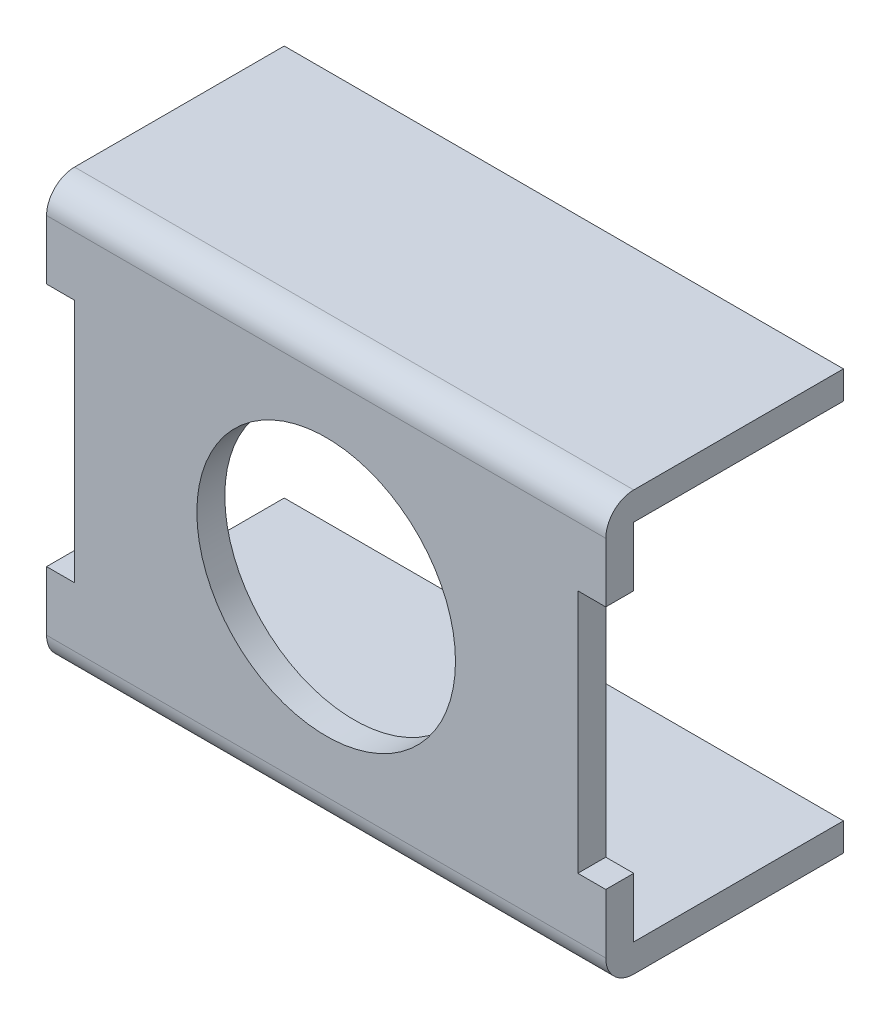
ISO-10303-21;
HEADER;
FILE_DESCRIPTION(('STEP AP214'),'2;1');
FILE_NAME('part.step','',(''),(''),'','','');
FILE_SCHEMA(('AUTOMOTIVE_DESIGN { 1 0 10303 214 1 1 1 1 }'));
ENDSEC;
DATA;
#1=APPLICATION_CONTEXT('core data for automotive mechanical design processes');
#2=APPLICATION_PROTOCOL_DEFINITION('international standard','automotive_design',2000,#1);
#3=PRODUCT_CONTEXT('',#1,'mechanical');
#4=PRODUCT('Part','Part','',(#3));
#5=PRODUCT_RELATED_PRODUCT_CATEGORY('part','',(#4));
#6=PRODUCT_DEFINITION_FORMATION('','',#4);
#7=PRODUCT_DEFINITION_CONTEXT('part definition',#1,'design');
#8=PRODUCT_DEFINITION('design','',#6,#7);
#9=PRODUCT_DEFINITION_SHAPE('','',#8);
#10=(LENGTH_UNIT() NAMED_UNIT(*) SI_UNIT(.MILLI.,.METRE.));
#11=(NAMED_UNIT(*) PLANE_ANGLE_UNIT() SI_UNIT($,.RADIAN.));
#12=(NAMED_UNIT(*) SI_UNIT($,.STERADIAN.) SOLID_ANGLE_UNIT());
#13=UNCERTAINTY_MEASURE_WITH_UNIT(LENGTH_MEASURE(1.E-05),#10,'distance_accuracy_value','');
#14=(GEOMETRIC_REPRESENTATION_CONTEXT(3) GLOBAL_UNCERTAINTY_ASSIGNED_CONTEXT((#13)) GLOBAL_UNIT_ASSIGNED_CONTEXT((#10,
#11,#12)) REPRESENTATION_CONTEXT('',''));
#15=CARTESIAN_POINT('',(0.,0.,0.));
#16=DIRECTION('',(0.,0.,1.));
#17=DIRECTION('',(1.,0.,0.));
#18=AXIS2_PLACEMENT_3D('',#15,#16,#17);
#19=CARTESIAN_POINT('',(2.,1.324596774194,-0.512903225806));
#20=DIRECTION('',(1.,0.,0.));
#21=DIRECTION('',(0.,0.,-1.));
#22=AXIS2_PLACEMENT_3D('',#19,#20,#21);
#23=PLANE('',#22);
#24=DIRECTION('',(0.,0.,1.));
#25=VECTOR('',#24,1.);
#26=CARTESIAN_POINT('',(2.,1.3,0.));
#27=LINE('',#26,#25);
#28=CARTESIAN_POINT('',(2.,1.3,0.));
#29=VERTEX_POINT('',#28);
#30=CARTESIAN_POINT('',(2.,1.3,-1.5));
#31=VERTEX_POINT('',#30);
#32=EDGE_CURVE('E221',#29,#31,#27,.F.);
#33=ORIENTED_EDGE('',*,*,#32,.T.);
#34=DIRECTION('',(0.,1.,0.));
#35=VECTOR('',#34,1.);
#36=CARTESIAN_POINT('',(2.,0.,-1.5));
#37=LINE('',#36,#35);
#38=CARTESIAN_POINT('',(2.,1.5,-1.5));
#39=VERTEX_POINT('',#38);
#40=EDGE_CURVE('E153',#31,#39,#37,.T.);
#41=ORIENTED_EDGE('',*,*,#40,.T.);
#42=DIRECTION('',(0.,0.,1.));
#43=VECTOR('',#42,1.);
#44=CARTESIAN_POINT('',(2.,1.5,-0.65));
#45=LINE('',#44,#43);
#46=CARTESIAN_POINT('',(2.,1.5,0.));
#47=VERTEX_POINT('',#46);
#48=EDGE_CURVE('E151',#47,#39,#45,.F.);
#49=ORIENTED_EDGE('',*,*,#48,.F.);
#50=CARTESIAN_POINT('',(2.,1.3,0.));
#51=DIRECTION('',(-1.,0.,0.));
#52=DIRECTION('',(0.,0.,1.));
#53=AXIS2_PLACEMENT_3D('',#50,#51,#52);
#54=CIRCLE('',#53,0.2);
#55=CARTESIAN_POINT('',(2.,1.3,0.2));
#56=VERTEX_POINT('',#55);
#57=EDGE_CURVE('E20',#47,#56,#54,.F.);
#58=ORIENTED_EDGE('',*,*,#57,.T.);
#59=DIRECTION('',(0.,1.,0.));
#60=VECTOR('',#59,1.);
#61=CARTESIAN_POINT('',(2.,1.324596774194,0.2));
#62=LINE('',#61,#60);
#63=CARTESIAN_POINT('',(2.,0.875,0.2));
#64=VERTEX_POINT('',#63);
#65=EDGE_CURVE('E149',#56,#64,#62,.F.);
#66=ORIENTED_EDGE('',*,*,#65,.T.);
#67=DIRECTION('',(0.,0.,-1.));
#68=VECTOR('',#67,1.);
#69=CARTESIAN_POINT('',(2.,0.875,-0.512903225806));
#70=LINE('',#69,#68);
#71=CARTESIAN_POINT('',(2.,0.875,0.));
#72=VERTEX_POINT('',#71);
#73=EDGE_CURVE('E195',#64,#72,#70,.T.);
#74=ORIENTED_EDGE('',*,*,#73,.T.);
#75=DIRECTION('',(0.,1.,0.));
#76=VECTOR('',#75,1.);
#77=CARTESIAN_POINT('',(2.,1.324596774194,0.));
#78=LINE('',#77,#76);
#79=EDGE_CURVE('E189',#72,#29,#78,.T.);
#80=ORIENTED_EDGE('',*,*,#79,.T.);
#81=EDGE_LOOP('',(#33,#41,#49,#58,#66,#74,#80));
#82=FACE_BOUND('',#81,.T.);
#83=ADVANCED_FACE('F17',(#82),#23,.T.);
#84=CARTESIAN_POINT('',(0.,0.,-1.5));
#85=DIRECTION('',(0.,0.,1.));
#86=DIRECTION('',(1.,0.,0.));
#87=AXIS2_PLACEMENT_3D('',#84,#85,#86);
#88=PLANE('',#87);
#89=ORIENTED_EDGE('',*,*,#40,.F.);
#90=DIRECTION('',(1.,0.,0.));
#91=VECTOR('',#90,1.);
#92=CARTESIAN_POINT('',(2.,1.3,-1.5));
#93=LINE('',#92,#91);
#94=CARTESIAN_POINT('',(-2.,1.3,-1.5));
#95=VERTEX_POINT('',#94);
#96=EDGE_CURVE('E241',#31,#95,#93,.F.);
#97=ORIENTED_EDGE('',*,*,#96,.T.);
#98=DIRECTION('',(0.,1.,0.));
#99=VECTOR('',#98,1.);
#100=CARTESIAN_POINT('',(-2.,1.324596774194,-1.5));
#101=LINE('',#100,#99);
#102=CARTESIAN_POINT('',(-2.,1.5,-1.5));
#103=VERTEX_POINT('',#102);
#104=EDGE_CURVE('E177',#103,#95,#101,.F.);
#105=ORIENTED_EDGE('',*,*,#104,.F.);
#106=DIRECTION('',(1.,0.,0.));
#107=VECTOR('',#106,1.);
#108=CARTESIAN_POINT('',(0.,1.5,-1.5));
#109=LINE('',#108,#107);
#110=EDGE_CURVE('E157',#39,#103,#109,.F.);
#111=ORIENTED_EDGE('',*,*,#110,.F.);
#112=EDGE_LOOP('',(#89,#97,#105,#111));
#113=FACE_BOUND('',#112,.T.);
#114=ADVANCED_FACE('F401',(#113),#88,.F.);
#115=CARTESIAN_POINT('',(-2.,1.324596774194,-0.512903225806));
#116=DIRECTION('',(-1.,0.,0.));
#117=DIRECTION('',(0.,0.,1.));
#118=AXIS2_PLACEMENT_3D('',#115,#116,#117);
#119=PLANE('',#118);
#120=DIRECTION('',(0.,1.,0.));
#121=VECTOR('',#120,1.);
#122=CARTESIAN_POINT('',(-2.,1.324596774194,0.));
#123=LINE('',#122,#121);
#124=CARTESIAN_POINT('',(-2.,1.3,0.));
#125=VERTEX_POINT('',#124);
#126=CARTESIAN_POINT('',(-2.,0.875,0.));
#127=VERTEX_POINT('',#126);
#128=EDGE_CURVE('E180',#125,#127,#123,.F.);
#129=ORIENTED_EDGE('',*,*,#128,.T.);
#130=DIRECTION('',(0.,0.,1.));
#131=VECTOR('',#130,1.);
#132=CARTESIAN_POINT('',(-2.,0.875,-0.512903225806));
#133=LINE('',#132,#131);
#134=CARTESIAN_POINT('',(-2.,0.875,0.2));
#135=VERTEX_POINT('',#134);
#136=EDGE_CURVE('E256',#127,#135,#133,.T.);
#137=ORIENTED_EDGE('',*,*,#136,.T.);
#138=DIRECTION('',(0.,1.,0.));
#139=VECTOR('',#138,1.);
#140=CARTESIAN_POINT('',(-2.,1.324596774194,0.2));
#141=LINE('',#140,#139);
#142=CARTESIAN_POINT('',(-2.,1.3,0.2));
#143=VERTEX_POINT('',#142);
#144=EDGE_CURVE('E188',#135,#143,#141,.T.);
#145=ORIENTED_EDGE('',*,*,#144,.T.);
#146=CARTESIAN_POINT('',(-2.,1.3,0.));
#147=DIRECTION('',(-1.,0.,0.));
#148=DIRECTION('',(0.,0.,1.));
#149=AXIS2_PLACEMENT_3D('',#146,#147,#148);
#150=CIRCLE('',#149,0.2);
#151=CARTESIAN_POINT('',(-2.,1.5,0.));
#152=VERTEX_POINT('',#151);
#153=EDGE_CURVE('E181',#143,#152,#150,.T.);
#154=ORIENTED_EDGE('',*,*,#153,.T.);
#155=DIRECTION('',(0.,0.,1.));
#156=VECTOR('',#155,1.);
#157=CARTESIAN_POINT('',(-2.,1.5,-0.65));
#158=LINE('',#157,#156);
#159=EDGE_CURVE('E163',#103,#152,#158,.T.);
#160=ORIENTED_EDGE('',*,*,#159,.F.);
#161=ORIENTED_EDGE('',*,*,#104,.T.);
#162=DIRECTION('',(0.,0.,1.));
#163=VECTOR('',#162,1.);
#164=CARTESIAN_POINT('',(-2.,1.3,0.));
#165=LINE('',#164,#163);
#166=EDGE_CURVE('E226',#95,#125,#165,.T.);
#167=ORIENTED_EDGE('',*,*,#166,.T.);
#168=EDGE_LOOP('',(#129,#137,#145,#154,#160,#161,#167));
#169=FACE_BOUND('',#168,.T.);
#170=ADVANCED_FACE('F392',(#169),#119,.T.);
#171=CARTESIAN_POINT('',(-2.,-1.324596774193,-0.512903225806));
#172=DIRECTION('',(-1.,0.,0.));
#173=DIRECTION('',(0.,0.,1.));
#174=AXIS2_PLACEMENT_3D('',#171,#172,#173);
#175=PLANE('',#174);
#176=DIRECTION('',(0.,0.,-1.));
#177=VECTOR('',#176,1.);
#178=CARTESIAN_POINT('',(-2.,-1.3,0.));
#179=LINE('',#178,#177);
#180=CARTESIAN_POINT('',(-2.,-1.3,0.));
#181=VERTEX_POINT('',#180);
#182=CARTESIAN_POINT('',(-2.,-1.3,-1.5));
#183=VERTEX_POINT('',#182);
#184=EDGE_CURVE('E201',#181,#183,#179,.T.);
#185=ORIENTED_EDGE('',*,*,#184,.T.);
#186=DIRECTION('',(0.,1.,0.));
#187=VECTOR('',#186,1.);
#188=CARTESIAN_POINT('',(-2.,0.,-1.5));
#189=LINE('',#188,#187);
#190=CARTESIAN_POINT('',(-2.,-1.5,-1.5));
#191=VERTEX_POINT('',#190);
#192=EDGE_CURVE('E304',#183,#191,#189,.F.);
#193=ORIENTED_EDGE('',*,*,#192,.T.);
#194=DIRECTION('',(0.,0.,-1.));
#195=VECTOR('',#194,1.);
#196=CARTESIAN_POINT('',(-2.,-1.5,-0.65));
#197=LINE('',#196,#195);
#198=CARTESIAN_POINT('',(-2.,-1.5,0.));
#199=VERTEX_POINT('',#198);
#200=EDGE_CURVE('E287',#199,#191,#197,.T.);
#201=ORIENTED_EDGE('',*,*,#200,.F.);
#202=CARTESIAN_POINT('',(-2.,-1.3,0.));
#203=DIRECTION('',(1.,0.,0.));
#204=DIRECTION('',(0.,0.,-1.));
#205=AXIS2_PLACEMENT_3D('',#202,#203,#204);
#206=CIRCLE('',#205,0.2);
#207=CARTESIAN_POINT('',(-2.,-1.3,0.2));
#208=VERTEX_POINT('',#207);
#209=EDGE_CURVE('E259',#199,#208,#206,.F.);
#210=ORIENTED_EDGE('',*,*,#209,.T.);
#211=DIRECTION('',(0.,1.,0.));
#212=VECTOR('',#211,1.);
#213=CARTESIAN_POINT('',(-2.,-1.324596774193,0.2));
#214=LINE('',#213,#212);
#215=CARTESIAN_POINT('',(-2.,-0.875,0.2));
#216=VERTEX_POINT('',#215);
#217=EDGE_CURVE('E233',#208,#216,#214,.T.);
#218=ORIENTED_EDGE('',*,*,#217,.T.);
#219=DIRECTION('',(0.,0.,1.));
#220=VECTOR('',#219,1.);
#221=CARTESIAN_POINT('',(-2.,-0.875,-0.512903225806));
#222=LINE('',#221,#220);
#223=CARTESIAN_POINT('',(-2.,-0.875,0.));
#224=VERTEX_POINT('',#223);
#225=EDGE_CURVE('E229',#216,#224,#222,.F.);
#226=ORIENTED_EDGE('',*,*,#225,.T.);
#227=DIRECTION('',(0.,1.,0.));
#228=VECTOR('',#227,1.);
#229=CARTESIAN_POINT('',(-2.,-1.324596774193,0.));
#230=LINE('',#229,#228);
#231=EDGE_CURVE('E232',#224,#181,#230,.F.);
#232=ORIENTED_EDGE('',*,*,#231,.T.);
#233=EDGE_LOOP('',(#185,#193,#201,#210,#218,#226,#232));
#234=FACE_BOUND('',#233,.T.);
#235=ADVANCED_FACE('F308',(#234),#175,.T.);
#236=CARTESIAN_POINT('',(0.,0.,-1.5));
#237=DIRECTION('',(0.,0.,1.));
#238=DIRECTION('',(1.,0.,0.));
#239=AXIS2_PLACEMENT_3D('',#236,#237,#238);
#240=PLANE('',#239);
#241=ORIENTED_EDGE('',*,*,#192,.F.);
#242=DIRECTION('',(1.,0.,0.));
#243=VECTOR('',#242,1.);
#244=CARTESIAN_POINT('',(-2.,-1.3,-1.5));
#245=LINE('',#244,#243);
#246=CARTESIAN_POINT('',(2.,-1.3,-1.5));
#247=VERTEX_POINT('',#246);
#248=EDGE_CURVE('E199',#183,#247,#245,.T.);
#249=ORIENTED_EDGE('',*,*,#248,.T.);
#250=DIRECTION('',(0.,1.,0.));
#251=VECTOR('',#250,1.);
#252=CARTESIAN_POINT('',(2.,-1.324596774194,-1.5));
#253=LINE('',#252,#251);
#254=CARTESIAN_POINT('',(2.,-1.5,-1.5));
#255=VERTEX_POINT('',#254);
#256=EDGE_CURVE('E277',#255,#247,#253,.T.);
#257=ORIENTED_EDGE('',*,*,#256,.F.);
#258=DIRECTION('',(1.,0.,0.));
#259=VECTOR('',#258,1.);
#260=CARTESIAN_POINT('',(0.,-1.5,-1.5));
#261=LINE('',#260,#259);
#262=EDGE_CURVE('E289',#191,#255,#261,.T.);
#263=ORIENTED_EDGE('',*,*,#262,.F.);
#264=EDGE_LOOP('',(#241,#249,#257,#263));
#265=FACE_BOUND('',#264,.T.);
#266=ADVANCED_FACE('F450',(#265),#240,.F.);
#267=CARTESIAN_POINT('',(2.,-1.324596774194,-0.512903225806));
#268=DIRECTION('',(1.,0.,0.));
#269=DIRECTION('',(0.,0.,-1.));
#270=AXIS2_PLACEMENT_3D('',#267,#268,#269);
#271=PLANE('',#270);
#272=DIRECTION('',(0.,1.,0.));
#273=VECTOR('',#272,1.);
#274=CARTESIAN_POINT('',(2.,-1.324596774194,0.));
#275=LINE('',#274,#273);
#276=CARTESIAN_POINT('',(2.,-1.3,0.));
#277=VERTEX_POINT('',#276);
#278=CARTESIAN_POINT('',(2.,-0.875,0.));
#279=VERTEX_POINT('',#278);
#280=EDGE_CURVE('E222',#277,#279,#275,.T.);
#281=ORIENTED_EDGE('',*,*,#280,.T.);
#282=DIRECTION('',(0.,0.,-1.));
#283=VECTOR('',#282,1.);
#284=CARTESIAN_POINT('',(2.,-0.875,-0.512903225806));
#285=LINE('',#284,#283);
#286=CARTESIAN_POINT('',(2.,-0.875,0.2));
#287=VERTEX_POINT('',#286);
#288=EDGE_CURVE('E218',#279,#287,#285,.F.);
#289=ORIENTED_EDGE('',*,*,#288,.T.);
#290=DIRECTION('',(0.,1.,0.));
#291=VECTOR('',#290,1.);
#292=CARTESIAN_POINT('',(2.,-1.324596774194,0.2));
#293=LINE('',#292,#291);
#294=CARTESIAN_POINT('',(2.,-1.3,0.2));
#295=VERTEX_POINT('',#294);
#296=EDGE_CURVE('E278',#287,#295,#293,.F.);
#297=ORIENTED_EDGE('',*,*,#296,.T.);
#298=CARTESIAN_POINT('',(2.,-1.3,0.));
#299=DIRECTION('',(1.,0.,0.));
#300=DIRECTION('',(0.,0.,-1.));
#301=AXIS2_PLACEMENT_3D('',#298,#299,#300);
#302=CIRCLE('',#301,0.2);
#303=CARTESIAN_POINT('',(2.,-1.5,0.));
#304=VERTEX_POINT('',#303);
#305=EDGE_CURVE('E275',#295,#304,#302,.T.);
#306=ORIENTED_EDGE('',*,*,#305,.T.);
#307=DIRECTION('',(0.,0.,-1.));
#308=VECTOR('',#307,1.);
#309=CARTESIAN_POINT('',(2.,-1.5,-0.65));
#310=LINE('',#309,#308);
#311=EDGE_CURVE('E295',#255,#304,#310,.F.);
#312=ORIENTED_EDGE('',*,*,#311,.F.);
#313=ORIENTED_EDGE('',*,*,#256,.T.);
#314=DIRECTION('',(0.,0.,-1.));
#315=VECTOR('',#314,1.);
#316=CARTESIAN_POINT('',(2.,-1.3,0.));
#317=LINE('',#316,#315);
#318=EDGE_CURVE('E158',#247,#277,#317,.F.);
#319=ORIENTED_EDGE('',*,*,#318,.T.);
#320=EDGE_LOOP('',(#281,#289,#297,#306,#312,#313,#319));
#321=FACE_BOUND('',#320,.T.);
#322=ADVANCED_FACE('F324',(#321),#271,.T.);
#323=CARTESIAN_POINT('',(2.,1.3,0.));
#324=DIRECTION('',(0.,1.,0.));
#325=DIRECTION('',(0.,0.,1.));
#326=AXIS2_PLACEMENT_3D('',#323,#324,#325);
#327=PLANE('',#326);
#328=ORIENTED_EDGE('',*,*,#166,.F.);
#329=ORIENTED_EDGE('',*,*,#96,.F.);
#330=ORIENTED_EDGE('',*,*,#32,.F.);
#331=DIRECTION('',(1.,0.,0.));
#332=VECTOR('',#331,1.);
#333=CARTESIAN_POINT('',(0.,1.3,0.));
#334=LINE('',#333,#332);
#335=EDGE_CURVE('E171',#29,#125,#334,.F.);
#336=ORIENTED_EDGE('',*,*,#335,.T.);
#337=EDGE_LOOP('',(#328,#329,#330,#336));
#338=FACE_BOUND('',#337,.T.);
#339=ADVANCED_FACE('F398',(#338),#327,.F.);
#340=CARTESIAN_POINT('',(-2.,-1.3,0.));
#341=DIRECTION('',(0.,-1.,0.));
#342=DIRECTION('',(0.,0.,-1.));
#343=AXIS2_PLACEMENT_3D('',#340,#341,#342);
#344=PLANE('',#343);
#345=ORIENTED_EDGE('',*,*,#318,.F.);
#346=ORIENTED_EDGE('',*,*,#248,.F.);
#347=ORIENTED_EDGE('',*,*,#184,.F.);
#348=DIRECTION('',(1.,0.,0.));
#349=VECTOR('',#348,1.);
#350=CARTESIAN_POINT('',(0.,-1.3,0.));
#351=LINE('',#350,#349);
#352=EDGE_CURVE('E165',#181,#277,#351,.T.);
#353=ORIENTED_EDGE('',*,*,#352,.T.);
#354=EDGE_LOOP('',(#345,#346,#347,#353));
#355=FACE_BOUND('',#354,.T.);
#356=ADVANCED_FACE('F377',(#355),#344,.F.);
#357=CARTESIAN_POINT('',(0.,1.5,-0.65));
#358=DIRECTION('',(0.,1.,0.));
#359=DIRECTION('',(0.,0.,1.));
#360=AXIS2_PLACEMENT_3D('',#357,#358,#359);
#361=PLANE('',#360);
#362=ORIENTED_EDGE('',*,*,#159,.T.);
#363=DIRECTION('',(-1.,0.,0.));
#364=VECTOR('',#363,1.);
#365=CARTESIAN_POINT('',(2.,1.5,0.));
#366=LINE('',#365,#364);
#367=EDGE_CURVE('E144',#47,#152,#366,.T.);
#368=ORIENTED_EDGE('',*,*,#367,.F.);
#369=ORIENTED_EDGE('',*,*,#48,.T.);
#370=ORIENTED_EDGE('',*,*,#110,.T.);
#371=EDGE_LOOP('',(#362,#368,#369,#370));
#372=FACE_BOUND('',#371,.T.);
#373=ADVANCED_FACE('F161',(#372),#361,.T.);
#374=CARTESIAN_POINT('',(0.,-1.5,-0.65));
#375=DIRECTION('',(0.,-1.,0.));
#376=DIRECTION('',(0.,0.,-1.));
#377=AXIS2_PLACEMENT_3D('',#374,#375,#376);
#378=PLANE('',#377);
#379=ORIENTED_EDGE('',*,*,#311,.T.);
#380=DIRECTION('',(1.,0.,0.));
#381=VECTOR('',#380,1.);
#382=CARTESIAN_POINT('',(-2.,-1.5,0.));
#383=LINE('',#382,#381);
#384=EDGE_CURVE('E319',#199,#304,#383,.T.);
#385=ORIENTED_EDGE('',*,*,#384,.F.);
#386=ORIENTED_EDGE('',*,*,#200,.T.);
#387=ORIENTED_EDGE('',*,*,#262,.T.);
#388=EDGE_LOOP('',(#379,#385,#386,#387));
#389=FACE_BOUND('',#388,.T.);
#390=ADVANCED_FACE('F326',(#389),#378,.T.);
#391=CARTESIAN_POINT('',(0.,0.,0.));
#392=DIRECTION('',(0.,0.,1.));
#393=DIRECTION('',(1.,0.,0.));
#394=AXIS2_PLACEMENT_3D('',#391,#392,#393);
#395=PLANE('',#394);
#396=CARTESIAN_POINT('',(0.,0.,0.));
#397=DIRECTION('',(0.,0.,1.));
#398=DIRECTION('',(1.,0.,0.));
#399=AXIS2_PLACEMENT_3D('',#396,#397,#398);
#400=CIRCLE('',#399,0.925);
#401=CARTESIAN_POINT('',(0.925,0.,0.));
#402=VERTEX_POINT('',#401);
#403=EDGE_CURVE('E251',#402,#402,#400,.T.);
#404=ORIENTED_EDGE('',*,*,#403,.T.);
#405=EDGE_LOOP('',(#404));
#406=FACE_BOUND('',#405,.T.);
#407=DIRECTION('',(0.,1.,0.));
#408=VECTOR('',#407,1.);
#409=CARTESIAN_POINT('',(1.8,0.875,0.));
#410=LINE('',#409,#408);
#411=CARTESIAN_POINT('',(1.8,0.875,0.));
#412=VERTEX_POINT('',#411);
#413=CARTESIAN_POINT('',(1.8,-0.875,0.));
#414=VERTEX_POINT('',#413);
#415=EDGE_CURVE('E355',#412,#414,#410,.F.);
#416=ORIENTED_EDGE('',*,*,#415,.T.);
#417=DIRECTION('',(1.,0.,0.));
#418=VECTOR('',#417,1.);
#419=CARTESIAN_POINT('',(1.8,-0.875,0.));
#420=LINE('',#419,#418);
#421=EDGE_CURVE('E338',#414,#279,#420,.T.);
#422=ORIENTED_EDGE('',*,*,#421,.T.);
#423=ORIENTED_EDGE('',*,*,#280,.F.);
#424=ORIENTED_EDGE('',*,*,#352,.F.);
#425=ORIENTED_EDGE('',*,*,#231,.F.);
#426=DIRECTION('',(1.,0.,0.));
#427=VECTOR('',#426,1.);
#428=CARTESIAN_POINT('',(-2.,-0.875,0.));
#429=LINE('',#428,#427);
#430=CARTESIAN_POINT('',(-1.8,-0.875,0.));
#431=VERTEX_POINT('',#430);
#432=EDGE_CURVE('E350',#224,#431,#429,.T.);
#433=ORIENTED_EDGE('',*,*,#432,.T.);
#434=DIRECTION('',(0.,1.,0.));
#435=VECTOR('',#434,1.);
#436=CARTESIAN_POINT('',(-1.8,-0.875,0.));
#437=LINE('',#436,#435);
#438=CARTESIAN_POINT('',(-1.8,0.875,0.));
#439=VERTEX_POINT('',#438);
#440=EDGE_CURVE('E168',#431,#439,#437,.T.);
#441=ORIENTED_EDGE('',*,*,#440,.T.);
#442=DIRECTION('',(1.,0.,0.));
#443=VECTOR('',#442,1.);
#444=CARTESIAN_POINT('',(-1.8,0.875,0.));
#445=LINE('',#444,#443);
#446=EDGE_CURVE('E164',#439,#127,#445,.F.);
#447=ORIENTED_EDGE('',*,*,#446,.T.);
#448=ORIENTED_EDGE('',*,*,#128,.F.);
#449=ORIENTED_EDGE('',*,*,#335,.F.);
#450=ORIENTED_EDGE('',*,*,#79,.F.);
#451=DIRECTION('',(1.,0.,0.));
#452=VECTOR('',#451,1.);
#453=CARTESIAN_POINT('',(2.,0.875,0.));
#454=LINE('',#453,#452);
#455=EDGE_CURVE('E359',#72,#412,#454,.F.);
#456=ORIENTED_EDGE('',*,*,#455,.T.);
#457=EDGE_LOOP('',(#416,#422,#423,#424,#425,#433,#441,#447,#448,#449,#450,#456));
#458=FACE_BOUND('',#457,.T.);
#459=ADVANCED_FACE('F371',(#406,#458),#395,.F.);
#460=CARTESIAN_POINT('',(2.,1.3,0.));
#461=DIRECTION('',(-1.,0.,0.));
#462=DIRECTION('',(0.,0.,1.));
#463=AXIS2_PLACEMENT_3D('',#460,#461,#462);
#464=CYLINDRICAL_SURFACE('',#463,0.2);
#465=ORIENTED_EDGE('',*,*,#153,.F.);
#466=DIRECTION('',(1.,0.,0.));
#467=VECTOR('',#466,1.);
#468=CARTESIAN_POINT('',(0.,1.3,0.2));
#469=LINE('',#468,#467);
#470=EDGE_CURVE('E146',#56,#143,#469,.F.);
#471=ORIENTED_EDGE('',*,*,#470,.F.);
#472=ORIENTED_EDGE('',*,*,#57,.F.);
#473=ORIENTED_EDGE('',*,*,#367,.T.);
#474=EDGE_LOOP('',(#465,#471,#472,#473));
#475=FACE_BOUND('',#474,.T.);
#476=ADVANCED_FACE('F142',(#475),#464,.T.);
#477=CARTESIAN_POINT('',(-1.8,0.875,0.2));
#478=DIRECTION('',(0.,1.,0.));
#479=DIRECTION('',(0.,0.,1.));
#480=AXIS2_PLACEMENT_3D('',#477,#478,#479);
#481=PLANE('',#480);
#482=ORIENTED_EDGE('',*,*,#446,.F.);
#483=DIRECTION('',(0.,0.,-1.));
#484=VECTOR('',#483,1.);
#485=CARTESIAN_POINT('',(-1.8,0.875,0.2));
#486=LINE('',#485,#484);
#487=CARTESIAN_POINT('',(-1.8,0.875,0.2));
#488=VERTEX_POINT('',#487);
#489=EDGE_CURVE('E348',#439,#488,#486,.F.);
#490=ORIENTED_EDGE('',*,*,#489,.T.);
#491=DIRECTION('',(1.,0.,0.));
#492=VECTOR('',#491,1.);
#493=CARTESIAN_POINT('',(0.,0.875,0.2));
#494=LINE('',#493,#492);
#495=EDGE_CURVE('E250',#135,#488,#494,.T.);
#496=ORIENTED_EDGE('',*,*,#495,.F.);
#497=ORIENTED_EDGE('',*,*,#136,.F.);
#498=EDGE_LOOP('',(#482,#490,#496,#497));
#499=FACE_BOUND('',#498,.T.);
#500=ADVANCED_FACE('F390',(#499),#481,.F.);
#501=CARTESIAN_POINT('',(-1.8,-0.875,0.2));
#502=DIRECTION('',(1.,0.,0.));
#503=DIRECTION('',(0.,0.,-1.));
#504=AXIS2_PLACEMENT_3D('',#501,#502,#503);
#505=PLANE('',#504);
#506=ORIENTED_EDGE('',*,*,#440,.F.);
#507=DIRECTION('',(0.,0.,-1.));
#508=VECTOR('',#507,1.);
#509=CARTESIAN_POINT('',(-1.8,-0.875,0.2));
#510=LINE('',#509,#508);
#511=CARTESIAN_POINT('',(-1.8,-0.875,0.2));
#512=VERTEX_POINT('',#511);
#513=EDGE_CURVE('E339',#431,#512,#510,.F.);
#514=ORIENTED_EDGE('',*,*,#513,.T.);
#515=DIRECTION('',(0.,1.,0.));
#516=VECTOR('',#515,1.);
#517=CARTESIAN_POINT('',(-1.8,0.,0.2));
#518=LINE('',#517,#516);
#519=EDGE_CURVE('E238',#488,#512,#518,.F.);
#520=ORIENTED_EDGE('',*,*,#519,.F.);
#521=ORIENTED_EDGE('',*,*,#489,.F.);
#522=EDGE_LOOP('',(#506,#514,#520,#521));
#523=FACE_BOUND('',#522,.T.);
#524=ADVANCED_FACE('F385',(#523),#505,.F.);
#525=CARTESIAN_POINT('',(-2.,-0.875,0.2));
#526=DIRECTION('',(0.,-1.,0.));
#527=DIRECTION('',(0.,0.,-1.));
#528=AXIS2_PLACEMENT_3D('',#525,#526,#527);
#529=PLANE('',#528);
#530=ORIENTED_EDGE('',*,*,#432,.F.);
#531=ORIENTED_EDGE('',*,*,#225,.F.);
#532=DIRECTION('',(1.,0.,0.));
#533=VECTOR('',#532,1.);
#534=CARTESIAN_POINT('',(0.,-0.875,0.2));
#535=LINE('',#534,#533);
#536=EDGE_CURVE('E212',#512,#216,#535,.F.);
#537=ORIENTED_EDGE('',*,*,#536,.F.);
#538=ORIENTED_EDGE('',*,*,#513,.F.);
#539=EDGE_LOOP('',(#530,#531,#537,#538));
#540=FACE_BOUND('',#539,.T.);
#541=ADVANCED_FACE('F382',(#540),#529,.F.);
#542=CARTESIAN_POINT('',(-2.,-1.3,0.));
#543=DIRECTION('',(1.,0.,0.));
#544=DIRECTION('',(0.,0.,-1.));
#545=AXIS2_PLACEMENT_3D('',#542,#543,#544);
#546=CYLINDRICAL_SURFACE('',#545,0.2);
#547=ORIENTED_EDGE('',*,*,#305,.F.);
#548=DIRECTION('',(1.,0.,0.));
#549=VECTOR('',#548,1.);
#550=CARTESIAN_POINT('',(0.,-1.3,0.2));
#551=LINE('',#550,#549);
#552=EDGE_CURVE('E208',#208,#295,#551,.T.);
#553=ORIENTED_EDGE('',*,*,#552,.F.);
#554=ORIENTED_EDGE('',*,*,#209,.F.);
#555=ORIENTED_EDGE('',*,*,#384,.T.);
#556=EDGE_LOOP('',(#547,#553,#554,#555));
#557=FACE_BOUND('',#556,.T.);
#558=ADVANCED_FACE('F317',(#557),#546,.T.);
#559=CARTESIAN_POINT('',(1.8,-0.875,0.2));
#560=DIRECTION('',(0.,-1.,0.));
#561=DIRECTION('',(0.,0.,-1.));
#562=AXIS2_PLACEMENT_3D('',#559,#560,#561);
#563=PLANE('',#562);
#564=ORIENTED_EDGE('',*,*,#421,.F.);
#565=DIRECTION('',(0.,0.,1.));
#566=VECTOR('',#565,1.);
#567=CARTESIAN_POINT('',(1.8,-0.875,0.2));
#568=LINE('',#567,#566);
#569=CARTESIAN_POINT('',(1.8,-0.875,0.2));
#570=VERTEX_POINT('',#569);
#571=EDGE_CURVE('E357',#414,#570,#568,.T.);
#572=ORIENTED_EDGE('',*,*,#571,.T.);
#573=DIRECTION('',(1.,0.,0.));
#574=VECTOR('',#573,1.);
#575=CARTESIAN_POINT('',(0.,-0.875,0.2));
#576=LINE('',#575,#574);
#577=EDGE_CURVE('E211',#287,#570,#576,.F.);
#578=ORIENTED_EDGE('',*,*,#577,.F.);
#579=ORIENTED_EDGE('',*,*,#288,.F.);
#580=EDGE_LOOP('',(#564,#572,#578,#579));
#581=FACE_BOUND('',#580,.T.);
#582=ADVANCED_FACE('F369',(#581),#563,.F.);
#583=CARTESIAN_POINT('',(1.8,0.875,0.2));
#584=DIRECTION('',(-1.,0.,0.));
#585=DIRECTION('',(0.,0.,1.));
#586=AXIS2_PLACEMENT_3D('',#583,#584,#585);
#587=PLANE('',#586);
#588=ORIENTED_EDGE('',*,*,#415,.F.);
#589=DIRECTION('',(0.,0.,1.));
#590=VECTOR('',#589,1.);
#591=CARTESIAN_POINT('',(1.8,0.875,0.2));
#592=LINE('',#591,#590);
#593=CARTESIAN_POINT('',(1.8,0.875,0.2));
#594=VERTEX_POINT('',#593);
#595=EDGE_CURVE('E35',#412,#594,#592,.T.);
#596=ORIENTED_EDGE('',*,*,#595,.T.);
#597=DIRECTION('',(0.,1.,0.));
#598=VECTOR('',#597,1.);
#599=CARTESIAN_POINT('',(1.8,0.,0.2));
#600=LINE('',#599,#598);
#601=EDGE_CURVE('E215',#570,#594,#600,.T.);
#602=ORIENTED_EDGE('',*,*,#601,.F.);
#603=ORIENTED_EDGE('',*,*,#571,.F.);
#604=EDGE_LOOP('',(#588,#596,#602,#603));
#605=FACE_BOUND('',#604,.T.);
#606=ADVANCED_FACE('F366',(#605),#587,.F.);
#607=CARTESIAN_POINT('',(2.,0.875,0.2));
#608=DIRECTION('',(0.,1.,0.));
#609=DIRECTION('',(0.,0.,1.));
#610=AXIS2_PLACEMENT_3D('',#607,#608,#609);
#611=PLANE('',#610);
#612=ORIENTED_EDGE('',*,*,#455,.F.);
#613=ORIENTED_EDGE('',*,*,#73,.F.);
#614=DIRECTION('',(1.,0.,0.));
#615=VECTOR('',#614,1.);
#616=CARTESIAN_POINT('',(0.,0.875,0.2));
#617=LINE('',#616,#615);
#618=EDGE_CURVE('E26',#594,#64,#617,.T.);
#619=ORIENTED_EDGE('',*,*,#618,.F.);
#620=ORIENTED_EDGE('',*,*,#595,.F.);
#621=EDGE_LOOP('',(#612,#613,#619,#620));
#622=FACE_BOUND('',#621,.T.);
#623=ADVANCED_FACE('F416',(#622),#611,.F.);
#624=CARTESIAN_POINT('',(0.,0.,0.2));
#625=DIRECTION('',(0.,0.,1.));
#626=DIRECTION('',(1.,0.,0.));
#627=AXIS2_PLACEMENT_3D('',#624,#625,#626);
#628=CYLINDRICAL_SURFACE('',#627,0.925);
#629=ORIENTED_EDGE('',*,*,#403,.F.);
#630=EDGE_LOOP('',(#629));
#631=FACE_BOUND('',#630,.T.);
#632=CARTESIAN_POINT('',(0.,0.,0.2));
#633=DIRECTION('',(0.,0.,1.));
#634=DIRECTION('',(1.,0.,0.));
#635=AXIS2_PLACEMENT_3D('',#632,#633,#634);
#636=CIRCLE('',#635,0.925);
#637=CARTESIAN_POINT('',(0.925,0.,0.2));
#638=VERTEX_POINT('',#637);
#639=EDGE_CURVE('E11',#638,#638,#636,.F.);
#640=ORIENTED_EDGE('',*,*,#639,.F.);
#641=EDGE_LOOP('',(#640));
#642=FACE_BOUND('',#641,.T.);
#643=ADVANCED_FACE('F410',(#631,#642),#628,.F.);
#644=CARTESIAN_POINT('',(0.,0.,0.2));
#645=DIRECTION('',(0.,0.,1.));
#646=DIRECTION('',(1.,0.,0.));
#647=AXIS2_PLACEMENT_3D('',#644,#645,#646);
#648=PLANE('',#647);
#649=ORIENTED_EDGE('',*,*,#639,.T.);
#650=EDGE_LOOP('',(#649));
#651=FACE_BOUND('',#650,.T.);
#652=ORIENTED_EDGE('',*,*,#601,.T.);
#653=ORIENTED_EDGE('',*,*,#618,.T.);
#654=ORIENTED_EDGE('',*,*,#65,.F.);
#655=ORIENTED_EDGE('',*,*,#470,.T.);
#656=ORIENTED_EDGE('',*,*,#144,.F.);
#657=ORIENTED_EDGE('',*,*,#495,.T.);
#658=ORIENTED_EDGE('',*,*,#519,.T.);
#659=ORIENTED_EDGE('',*,*,#536,.T.);
#660=ORIENTED_EDGE('',*,*,#217,.F.);
#661=ORIENTED_EDGE('',*,*,#552,.T.);
#662=ORIENTED_EDGE('',*,*,#296,.F.);
#663=ORIENTED_EDGE('',*,*,#577,.T.);
#664=EDGE_LOOP('',(#652,#653,#654,#655,#656,#657,#658,#659,#660,#661,#662,#663));
#665=FACE_BOUND('',#664,.T.);
#666=ADVANCED_FACE('F312',(#651,#665),#648,.T.);
#667=CLOSED_SHELL('',(#83,#114,#170,#235,#266,#322,#339,#356,#373,#390,#459,#476,#500,#524,#541,
#558,#582,#606,#623,#643,#666));
#668=MANIFOLD_SOLID_BREP('B1',#667);
#669=ADVANCED_BREP_SHAPE_REPRESENTATION('',(#18,#668),#14);
#670=SHAPE_DEFINITION_REPRESENTATION(#9,#669);
ENDSEC;
END-ISO-10303-21;
